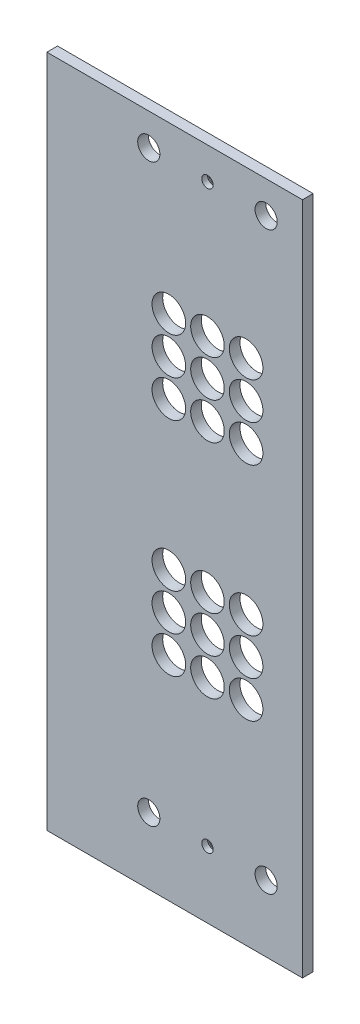
ISO-10303-21;
HEADER;
FILE_DESCRIPTION(('STEP AP214'),'2;1');
FILE_NAME('part.step','',(''),(''),'','','');
FILE_SCHEMA(('AUTOMOTIVE_DESIGN { 1 0 10303 214 1 1 1 1 }'));
ENDSEC;
DATA;
#1=APPLICATION_CONTEXT('core data for automotive mechanical design processes');
#2=APPLICATION_PROTOCOL_DEFINITION('international standard','automotive_design',2000,#1);
#3=PRODUCT_CONTEXT('',#1,'mechanical');
#4=PRODUCT('Part','Part','',(#3));
#5=PRODUCT_RELATED_PRODUCT_CATEGORY('part','',(#4));
#6=PRODUCT_DEFINITION_FORMATION('','',#4);
#7=PRODUCT_DEFINITION_CONTEXT('part definition',#1,'design');
#8=PRODUCT_DEFINITION('design','',#6,#7);
#9=PRODUCT_DEFINITION_SHAPE('','',#8);
#10=(LENGTH_UNIT() NAMED_UNIT(*) SI_UNIT(.MILLI.,.METRE.));
#11=(NAMED_UNIT(*) PLANE_ANGLE_UNIT() SI_UNIT($,.RADIAN.));
#12=(NAMED_UNIT(*) SI_UNIT($,.STERADIAN.) SOLID_ANGLE_UNIT());
#13=UNCERTAINTY_MEASURE_WITH_UNIT(LENGTH_MEASURE(1.E-05),#10,'distance_accuracy_value','');
#14=(GEOMETRIC_REPRESENTATION_CONTEXT(3) GLOBAL_UNCERTAINTY_ASSIGNED_CONTEXT((#13)) GLOBAL_UNIT_ASSIGNED_CONTEXT((#10,
#11,#12)) REPRESENTATION_CONTEXT('',''));
#15=CARTESIAN_POINT('',(0.,0.,0.));
#16=DIRECTION('',(0.,0.,1.));
#17=DIRECTION('',(1.,0.,0.));
#18=AXIS2_PLACEMENT_3D('',#15,#16,#17);
#19=CARTESIAN_POINT('',(28.275,98.7125,3.175));
#20=DIRECTION('',(-1.,0.,0.));
#21=DIRECTION('',(0.,-1.,0.));
#22=AXIS2_PLACEMENT_3D('',#19,#20,#21);
#23=PLANE('',#22);
#24=DIRECTION('',(0.,1.,0.));
#25=VECTOR('',#24,1.);
#26=CARTESIAN_POINT('',(28.275,98.7125,0.));
#27=LINE('',#26,#25);
#28=CARTESIAN_POINT('',(28.275,-98.7125,0.));
#29=VERTEX_POINT('',#28);
#30=CARTESIAN_POINT('',(28.275,101.8875,0.));
#31=VERTEX_POINT('',#30);
#32=EDGE_CURVE('E76',#29,#31,#27,.T.);
#33=ORIENTED_EDGE('',*,*,#32,.T.);
#34=DIRECTION('',(0.,0.,-1.));
#35=VECTOR('',#34,1.);
#36=CARTESIAN_POINT('',(28.275,101.8875,3.175));
#37=LINE('',#36,#35);
#38=CARTESIAN_POINT('',(28.275,101.8875,3.175));
#39=VERTEX_POINT('',#38);
#40=EDGE_CURVE('E80',#39,#31,#37,.T.);
#41=ORIENTED_EDGE('',*,*,#40,.F.);
#42=DIRECTION('',(0.,1.,0.));
#43=VECTOR('',#42,1.);
#44=CARTESIAN_POINT('',(28.275,98.7125,3.175));
#45=LINE('',#44,#43);
#46=CARTESIAN_POINT('',(28.275,-98.7125,3.175));
#47=VERTEX_POINT('',#46);
#48=EDGE_CURVE('E221',#47,#39,#45,.T.);
#49=ORIENTED_EDGE('',*,*,#48,.F.);
#50=DIRECTION('',(0.,0.,-1.));
#51=VECTOR('',#50,1.);
#52=CARTESIAN_POINT('',(28.275,-98.7125,3.175));
#53=LINE('',#52,#51);
#54=EDGE_CURVE('E11',#47,#29,#53,.T.);
#55=ORIENTED_EDGE('',*,*,#54,.T.);
#56=EDGE_LOOP('',(#33,#41,#49,#55));
#57=FACE_BOUND('',#56,.T.);
#58=ADVANCED_FACE('F41',(#57),#23,.F.);
#59=CARTESIAN_POINT('',(-28.275,-98.7125,3.175));
#60=DIRECTION('',(0.,1.,0.));
#61=DIRECTION('',(0.,0.,1.));
#62=AXIS2_PLACEMENT_3D('',#59,#60,#61);
#63=PLANE('',#62);
#64=DIRECTION('',(1.,0.,0.));
#65=VECTOR('',#64,1.);
#66=CARTESIAN_POINT('',(-28.275,-98.7125,0.));
#67=LINE('',#66,#65);
#68=CARTESIAN_POINT('',(-47.8,-98.7125,0.));
#69=VERTEX_POINT('',#68);
#70=EDGE_CURVE('E82',#69,#29,#67,.T.);
#71=ORIENTED_EDGE('',*,*,#70,.T.);
#72=ORIENTED_EDGE('',*,*,#54,.F.);
#73=DIRECTION('',(1.,0.,0.));
#74=VECTOR('',#73,1.);
#75=CARTESIAN_POINT('',(-28.275,-98.7125,3.175));
#76=LINE('',#75,#74);
#77=CARTESIAN_POINT('',(-47.8,-98.7125,3.175));
#78=VERTEX_POINT('',#77);
#79=EDGE_CURVE('E49',#78,#47,#76,.T.);
#80=ORIENTED_EDGE('',*,*,#79,.F.);
#81=DIRECTION('',(0.,0.,1.));
#82=VECTOR('',#81,1.);
#83=CARTESIAN_POINT('',(-47.8,-98.7125,0.));
#84=LINE('',#83,#82);
#85=EDGE_CURVE('E109',#69,#78,#84,.T.);
#86=ORIENTED_EDGE('',*,*,#85,.F.);
#87=EDGE_LOOP('',(#71,#72,#80,#86));
#88=FACE_BOUND('',#87,.T.);
#89=ADVANCED_FACE('F225',(#88),#63,.F.);
#90=CARTESIAN_POINT('',(0.,0.,3.175));
#91=DIRECTION('',(0.,0.,1.));
#92=DIRECTION('',(1.,0.,0.));
#93=AXIS2_PLACEMENT_3D('',#90,#91,#92);
#94=PLANE('',#93);
#95=CARTESIAN_POINT('',(2.7748636721725E-11,-78.8874998999741,3.175));
#96=DIRECTION('',(0.,0.,-1.));
#97=DIRECTION('',(-1.,0.,0.));
#98=AXIS2_PLACEMENT_3D('',#95,#96,#97);
#99=CIRCLE('',#98,1.69999999999999);
#100=CARTESIAN_POINT('',(-1.69999999997224,-78.8874998999741,3.175));
#101=VERTEX_POINT('',#100);
#102=EDGE_CURVE('E658',#101,#101,#99,.T.);
#103=ORIENTED_EDGE('',*,*,#102,.T.);
#104=EDGE_LOOP('',(#103));
#105=FACE_BOUND('',#104,.T.);
#106=CARTESIAN_POINT('',(3.18841642153557E-11,92.3625001000331,3.175));
#107=DIRECTION('',(0.,0.,-1.));
#108=DIRECTION('',(-1.,0.,0.));
#109=AXIS2_PLACEMENT_3D('',#106,#107,#108);
#110=CIRCLE('',#109,1.69999999999999);
#111=CARTESIAN_POINT('',(-1.6999999999681,92.3625001000331,3.175));
#112=VERTEX_POINT('',#111);
#113=EDGE_CURVE('E668',#112,#112,#110,.T.);
#114=ORIENTED_EDGE('',*,*,#113,.T.);
#115=EDGE_LOOP('',(#114));
#116=FACE_BOUND('',#115,.T.);
#117=CARTESIAN_POINT('',(-17.462499999999,92.362500099974,3.175));
#118=DIRECTION('',(0.,0.,1.));
#119=DIRECTION('',(1.,0.,0.));
#120=AXIS2_PLACEMENT_3D('',#117,#118,#119);
#121=CIRCLE('',#120,3.29999999999999);
#122=CARTESIAN_POINT('',(-14.1624999999991,92.362500099974,3.175));
#123=VERTEX_POINT('',#122);
#124=EDGE_CURVE('E671',#123,#123,#121,.T.);
#125=ORIENTED_EDGE('',*,*,#124,.F.);
#126=EDGE_LOOP('',(#125));
#127=FACE_BOUND('',#126,.T.);
#128=CARTESIAN_POINT('',(17.462500000001,92.362500099974,3.175));
#129=DIRECTION('',(0.,0.,1.));
#130=DIRECTION('',(1.,0.,0.));
#131=AXIS2_PLACEMENT_3D('',#128,#129,#130);
#132=CIRCLE('',#131,3.29999999999999);
#133=CARTESIAN_POINT('',(20.7625000000009,92.362500099974,3.175));
#134=VERTEX_POINT('',#133);
#135=EDGE_CURVE('E677',#134,#134,#132,.T.);
#136=ORIENTED_EDGE('',*,*,#135,.F.);
#137=EDGE_LOOP('',(#136));
#138=FACE_BOUND('',#137,.T.);
#139=CARTESIAN_POINT('',(17.4625000000277,-78.8874998999741,3.175));
#140=DIRECTION('',(0.,0.,1.));
#141=DIRECTION('',(1.,0.,0.));
#142=AXIS2_PLACEMENT_3D('',#139,#140,#141);
#143=CIRCLE('',#142,3.29999999999999);
#144=CARTESIAN_POINT('',(20.7625000000277,-78.8874998999741,3.175));
#145=VERTEX_POINT('',#144);
#146=EDGE_CURVE('E683',#145,#145,#143,.T.);
#147=ORIENTED_EDGE('',*,*,#146,.F.);
#148=EDGE_LOOP('',(#147));
#149=FACE_BOUND('',#148,.T.);
#150=CARTESIAN_POINT('',(-17.4624999999723,-78.8874998999741,3.175));
#151=DIRECTION('',(0.,0.,1.));
#152=DIRECTION('',(1.,0.,0.));
#153=AXIS2_PLACEMENT_3D('',#150,#151,#152);
#154=CIRCLE('',#153,3.29999999999999);
#155=CARTESIAN_POINT('',(-14.1624999999723,-78.8874998999741,3.175));
#156=VERTEX_POINT('',#155);
#157=EDGE_CURVE('E102',#156,#156,#154,.T.);
#158=ORIENTED_EDGE('',*,*,#157,.F.);
#159=EDGE_LOOP('',(#158));
#160=FACE_BOUND('',#159,.T.);
#161=CARTESIAN_POINT('',(0.,30.6308371608476,3.175));
#162=DIRECTION('',(0.,0.,-1.));
#163=DIRECTION('',(-1.,0.,0.));
#164=AXIS2_PLACEMENT_3D('',#161,#162,#163);
#165=CIRCLE('',#164,4.9999999999989);
#166=CARTESIAN_POINT('',(-4.99999999999893,30.6308371608476,3.175));
#167=VERTEX_POINT('',#166);
#168=EDGE_CURVE('E149',#167,#167,#165,.T.);
#169=ORIENTED_EDGE('',*,*,#168,.T.);
#170=EDGE_LOOP('',(#169));
#171=FACE_BOUND('',#170,.T.);
#172=CARTESIAN_POINT('',(11.5,30.6308371608476,3.175));
#173=DIRECTION('',(0.,0.,-1.));
#174=DIRECTION('',(-1.,0.,0.));
#175=AXIS2_PLACEMENT_3D('',#172,#173,#174);
#176=CIRCLE('',#175,4.9999999999989);
#177=CARTESIAN_POINT('',(6.50000000000107,30.6308371608476,3.175));
#178=VERTEX_POINT('',#177);
#179=EDGE_CURVE('E155',#178,#178,#176,.T.);
#180=ORIENTED_EDGE('',*,*,#179,.T.);
#181=EDGE_LOOP('',(#180));
#182=FACE_BOUND('',#181,.T.);
#183=CARTESIAN_POINT('',(-11.5,41.6308371608475,3.175));
#184=DIRECTION('',(0.,0.,-1.));
#185=DIRECTION('',(-1.,0.,0.));
#186=AXIS2_PLACEMENT_3D('',#183,#184,#185);
#187=CIRCLE('',#186,4.9999999999989);
#188=CARTESIAN_POINT('',(-16.4999999999989,41.6308371608475,3.175));
#189=VERTEX_POINT('',#188);
#190=EDGE_CURVE('E161',#189,#189,#187,.T.);
#191=ORIENTED_EDGE('',*,*,#190,.T.);
#192=EDGE_LOOP('',(#191));
#193=FACE_BOUND('',#192,.T.);
#194=CARTESIAN_POINT('',(0.,41.6308371608475,3.175));
#195=DIRECTION('',(0.,0.,-1.));
#196=DIRECTION('',(-1.,0.,0.));
#197=AXIS2_PLACEMENT_3D('',#194,#195,#196);
#198=CIRCLE('',#197,4.9999999999989);
#199=CARTESIAN_POINT('',(-4.99999999999893,41.6308371608475,3.175));
#200=VERTEX_POINT('',#199);
#201=EDGE_CURVE('E136',#200,#200,#198,.T.);
#202=ORIENTED_EDGE('',*,*,#201,.T.);
#203=EDGE_LOOP('',(#202));
#204=FACE_BOUND('',#203,.T.);
#205=CARTESIAN_POINT('',(11.5,52.6308371608475,3.175));
#206=DIRECTION('',(0.,0.,-1.));
#207=DIRECTION('',(-1.,0.,0.));
#208=AXIS2_PLACEMENT_3D('',#205,#206,#207);
#209=CIRCLE('',#208,4.9999999999989);
#210=CARTESIAN_POINT('',(6.50000000000107,52.6308371608475,3.175));
#211=VERTEX_POINT('',#210);
#212=EDGE_CURVE('E118',#211,#211,#209,.T.);
#213=ORIENTED_EDGE('',*,*,#212,.T.);
#214=EDGE_LOOP('',(#213));
#215=FACE_BOUND('',#214,.T.);
#216=CARTESIAN_POINT('',(0.,52.6308371608475,3.175));
#217=DIRECTION('',(0.,0.,-1.));
#218=DIRECTION('',(-1.,0.,0.));
#219=AXIS2_PLACEMENT_3D('',#216,#217,#218);
#220=CIRCLE('',#219,4.9999999999989);
#221=CARTESIAN_POINT('',(-4.99999999999893,52.6308371608475,3.175));
#222=VERTEX_POINT('',#221);
#223=EDGE_CURVE('E125',#222,#222,#220,.T.);
#224=ORIENTED_EDGE('',*,*,#223,.T.);
#225=EDGE_LOOP('',(#224));
#226=FACE_BOUND('',#225,.T.);
#227=CARTESIAN_POINT('',(-11.5,52.6308371608475,3.175));
#228=DIRECTION('',(0.,0.,-1.));
#229=DIRECTION('',(-1.,0.,0.));
#230=AXIS2_PLACEMENT_3D('',#227,#228,#229);
#231=CIRCLE('',#230,4.9999999999989);
#232=CARTESIAN_POINT('',(-16.4999999999989,52.6308371608475,3.175));
#233=VERTEX_POINT('',#232);
#234=EDGE_CURVE('E124',#233,#233,#231,.T.);
#235=ORIENTED_EDGE('',*,*,#234,.T.);
#236=EDGE_LOOP('',(#235));
#237=FACE_BOUND('',#236,.T.);
#238=CARTESIAN_POINT('',(11.5,41.6308371608475,3.175));
#239=DIRECTION('',(0.,0.,-1.));
#240=DIRECTION('',(-1.,0.,0.));
#241=AXIS2_PLACEMENT_3D('',#238,#239,#240);
#242=CIRCLE('',#241,4.9999999999989);
#243=CARTESIAN_POINT('',(6.50000000000107,41.6308371608475,3.175));
#244=VERTEX_POINT('',#243);
#245=EDGE_CURVE('E137',#244,#244,#242,.T.);
#246=ORIENTED_EDGE('',*,*,#245,.T.);
#247=EDGE_LOOP('',(#246));
#248=FACE_BOUND('',#247,.T.);
#249=CARTESIAN_POINT('',(-11.5,-13.3691628391524,3.175));
#250=DIRECTION('',(0.,0.,-1.));
#251=DIRECTION('',(-1.,0.,0.));
#252=AXIS2_PLACEMENT_3D('',#249,#250,#251);
#253=CIRCLE('',#252,4.9999999999989);
#254=CARTESIAN_POINT('',(-16.4999999999989,-13.3691628391524,3.175));
#255=VERTEX_POINT('',#254);
#256=EDGE_CURVE('E209',#255,#255,#253,.T.);
#257=ORIENTED_EDGE('',*,*,#256,.T.);
#258=EDGE_LOOP('',(#257));
#259=FACE_BOUND('',#258,.T.);
#260=CARTESIAN_POINT('',(0.,-13.3691628391524,3.175));
#261=DIRECTION('',(0.,0.,-1.));
#262=DIRECTION('',(-1.,0.,0.));
#263=AXIS2_PLACEMENT_3D('',#260,#261,#262);
#264=CIRCLE('',#263,4.9999999999989);
#265=CARTESIAN_POINT('',(-4.99999999999892,-13.3691628391524,3.175));
#266=VERTEX_POINT('',#265);
#267=EDGE_CURVE('E198',#266,#266,#264,.T.);
#268=ORIENTED_EDGE('',*,*,#267,.T.);
#269=EDGE_LOOP('',(#268));
#270=FACE_BOUND('',#269,.T.);
#271=CARTESIAN_POINT('',(11.5,-13.3691628391524,3.175));
#272=DIRECTION('',(0.,0.,-1.));
#273=DIRECTION('',(-1.,0.,0.));
#274=AXIS2_PLACEMENT_3D('',#271,#272,#273);
#275=CIRCLE('',#274,4.9999999999989);
#276=CARTESIAN_POINT('',(6.50000000000108,-13.3691628391524,3.175));
#277=VERTEX_POINT('',#276);
#278=EDGE_CURVE('E199',#277,#277,#275,.T.);
#279=ORIENTED_EDGE('',*,*,#278,.T.);
#280=EDGE_LOOP('',(#279));
#281=FACE_BOUND('',#280,.T.);
#282=CARTESIAN_POINT('',(-11.5,30.6308371608476,3.175));
#283=DIRECTION('',(0.,0.,-1.));
#284=DIRECTION('',(-1.,0.,0.));
#285=AXIS2_PLACEMENT_3D('',#282,#283,#284);
#286=CIRCLE('',#285,4.9999999999989);
#287=CARTESIAN_POINT('',(-16.4999999999989,30.6308371608476,3.175));
#288=VERTEX_POINT('',#287);
#289=EDGE_CURVE('E148',#288,#288,#286,.T.);
#290=ORIENTED_EDGE('',*,*,#289,.T.);
#291=EDGE_LOOP('',(#290));
#292=FACE_BOUND('',#291,.T.);
#293=CARTESIAN_POINT('',(0.,-35.3691628391525,3.175));
#294=DIRECTION('',(0.,0.,-1.));
#295=DIRECTION('',(-1.,0.,0.));
#296=AXIS2_PLACEMENT_3D('',#293,#294,#295);
#297=CIRCLE('',#296,4.9999999999989);
#298=CARTESIAN_POINT('',(-4.99999999999892,-35.3691628391525,3.175));
#299=VERTEX_POINT('',#298);
#300=EDGE_CURVE('E187',#299,#299,#297,.T.);
#301=ORIENTED_EDGE('',*,*,#300,.T.);
#302=EDGE_LOOP('',(#301));
#303=FACE_BOUND('',#302,.T.);
#304=CARTESIAN_POINT('',(-11.5,-24.3691628391524,3.175));
#305=DIRECTION('',(0.,0.,-1.));
#306=DIRECTION('',(-1.,0.,0.));
#307=AXIS2_PLACEMENT_3D('',#304,#305,#306);
#308=CIRCLE('',#307,4.9999999999989);
#309=CARTESIAN_POINT('',(-16.4999999999989,-24.3691628391524,3.175));
#310=VERTEX_POINT('',#309);
#311=EDGE_CURVE('E172',#310,#310,#308,.T.);
#312=ORIENTED_EDGE('',*,*,#311,.T.);
#313=EDGE_LOOP('',(#312));
#314=FACE_BOUND('',#313,.T.);
#315=CARTESIAN_POINT('',(0.,-24.3691628391524,3.175));
#316=DIRECTION('',(0.,0.,-1.));
#317=DIRECTION('',(-1.,0.,0.));
#318=AXIS2_PLACEMENT_3D('',#315,#316,#317);
#319=CIRCLE('',#318,4.9999999999989);
#320=CARTESIAN_POINT('',(-4.99999999999892,-24.3691628391524,3.175));
#321=VERTEX_POINT('',#320);
#322=EDGE_CURVE('E173',#321,#321,#319,.T.);
#323=ORIENTED_EDGE('',*,*,#322,.T.);
#324=EDGE_LOOP('',(#323));
#325=FACE_BOUND('',#324,.T.);
#326=CARTESIAN_POINT('',(11.5,-24.3691628391524,3.175));
#327=DIRECTION('',(0.,0.,-1.));
#328=DIRECTION('',(-1.,0.,0.));
#329=AXIS2_PLACEMENT_3D('',#326,#327,#328);
#330=CIRCLE('',#329,4.9999999999989);
#331=CARTESIAN_POINT('',(6.50000000000108,-24.3691628391524,3.175));
#332=VERTEX_POINT('',#331);
#333=EDGE_CURVE('E179',#332,#332,#330,.T.);
#334=ORIENTED_EDGE('',*,*,#333,.T.);
#335=EDGE_LOOP('',(#334));
#336=FACE_BOUND('',#335,.T.);
#337=CARTESIAN_POINT('',(11.5,-35.3691628391525,3.175));
#338=DIRECTION('',(0.,0.,-1.));
#339=DIRECTION('',(-1.,0.,0.));
#340=AXIS2_PLACEMENT_3D('',#337,#338,#339);
#341=CIRCLE('',#340,4.9999999999989);
#342=CARTESIAN_POINT('',(6.50000000000108,-35.3691628391525,3.175));
#343=VERTEX_POINT('',#342);
#344=EDGE_CURVE('E114',#343,#343,#341,.T.);
#345=ORIENTED_EDGE('',*,*,#344,.T.);
#346=EDGE_LOOP('',(#345));
#347=FACE_BOUND('',#346,.T.);
#348=CARTESIAN_POINT('',(-11.5,-35.3691628391525,3.175));
#349=DIRECTION('',(0.,0.,-1.));
#350=DIRECTION('',(-1.,0.,0.));
#351=AXIS2_PLACEMENT_3D('',#348,#349,#350);
#352=CIRCLE('',#351,4.9999999999989);
#353=CARTESIAN_POINT('',(-16.4999999999989,-35.3691628391525,3.175));
#354=VERTEX_POINT('',#353);
#355=EDGE_CURVE('E83',#354,#354,#352,.T.);
#356=ORIENTED_EDGE('',*,*,#355,.T.);
#357=EDGE_LOOP('',(#356));
#358=FACE_BOUND('',#357,.T.);
#359=ORIENTED_EDGE('',*,*,#48,.T.);
#360=DIRECTION('',(1.,0.,0.));
#361=VECTOR('',#360,1.);
#362=CARTESIAN_POINT('',(-47.8,101.8875,3.175));
#363=LINE('',#362,#361);
#364=CARTESIAN_POINT('',(-47.8,101.8875,3.175));
#365=VERTEX_POINT('',#364);
#366=EDGE_CURVE('E98',#365,#39,#363,.T.);
#367=ORIENTED_EDGE('',*,*,#366,.F.);
#368=DIRECTION('',(0.,1.,0.));
#369=VECTOR('',#368,1.);
#370=CARTESIAN_POINT('',(-47.8,-98.7125,3.175));
#371=LINE('',#370,#369);
#372=EDGE_CURVE('E112',#78,#365,#371,.T.);
#373=ORIENTED_EDGE('',*,*,#372,.F.);
#374=ORIENTED_EDGE('',*,*,#79,.T.);
#375=EDGE_LOOP('',(#359,#367,#373,#374));
#376=FACE_BOUND('',#375,.T.);
#377=ADVANCED_FACE('F228',(#105,#116,#127,#138,#149,#160,#171,#182,#193,#204,#215,#226,#237,
#248,#259,#270,#281,#292,#303,#314,#325,#336,#347,#358,#376),#94,.T.);
#378=CARTESIAN_POINT('',(0.,0.,0.));
#379=DIRECTION('',(0.,0.,1.));
#380=DIRECTION('',(1.,0.,0.));
#381=AXIS2_PLACEMENT_3D('',#378,#379,#380);
#382=PLANE('',#381);
#383=CARTESIAN_POINT('',(2.7748636721725E-11,-78.8874998999741,0.));
#384=DIRECTION('',(0.,0.,-1.));
#385=DIRECTION('',(-1.,0.,0.));
#386=AXIS2_PLACEMENT_3D('',#383,#384,#385);
#387=CIRCLE('',#386,3.15);
#388=CARTESIAN_POINT('',(-3.14999999997225,-78.8874998999741,0.));
#389=VERTEX_POINT('',#388);
#390=EDGE_CURVE('E656',#389,#389,#387,.T.);
#391=ORIENTED_EDGE('',*,*,#390,.F.);
#392=EDGE_LOOP('',(#391));
#393=FACE_BOUND('',#392,.T.);
#394=CARTESIAN_POINT('',(3.18841642153557E-11,92.3625001000331,0.));
#395=DIRECTION('',(0.,0.,-1.));
#396=DIRECTION('',(-1.,0.,0.));
#397=AXIS2_PLACEMENT_3D('',#394,#395,#396);
#398=CIRCLE('',#397,3.15);
#399=CARTESIAN_POINT('',(-3.14999999996812,92.3625001000331,0.));
#400=VERTEX_POINT('',#399);
#401=EDGE_CURVE('E662',#400,#400,#398,.T.);
#402=ORIENTED_EDGE('',*,*,#401,.F.);
#403=EDGE_LOOP('',(#402));
#404=FACE_BOUND('',#403,.T.);
#405=CARTESIAN_POINT('',(-17.462499999999,92.362500099974,0.));
#406=DIRECTION('',(0.,0.,1.));
#407=DIRECTION('',(1.,0.,0.));
#408=AXIS2_PLACEMENT_3D('',#405,#406,#407);
#409=CIRCLE('',#408,3.29999999999999);
#410=CARTESIAN_POINT('',(-14.1624999999991,92.362500099974,0.));
#411=VERTEX_POINT('',#410);
#412=EDGE_CURVE('E674',#411,#411,#409,.T.);
#413=ORIENTED_EDGE('',*,*,#412,.T.);
#414=EDGE_LOOP('',(#413));
#415=FACE_BOUND('',#414,.T.);
#416=CARTESIAN_POINT('',(17.462500000001,92.362500099974,0.));
#417=DIRECTION('',(0.,0.,1.));
#418=DIRECTION('',(1.,0.,0.));
#419=AXIS2_PLACEMENT_3D('',#416,#417,#418);
#420=CIRCLE('',#419,3.29999999999999);
#421=CARTESIAN_POINT('',(20.7625000000009,92.362500099974,0.));
#422=VERTEX_POINT('',#421);
#423=EDGE_CURVE('E680',#422,#422,#420,.T.);
#424=ORIENTED_EDGE('',*,*,#423,.T.);
#425=EDGE_LOOP('',(#424));
#426=FACE_BOUND('',#425,.T.);
#427=CARTESIAN_POINT('',(17.4625000000277,-78.8874998999741,0.));
#428=DIRECTION('',(0.,0.,1.));
#429=DIRECTION('',(1.,0.,0.));
#430=AXIS2_PLACEMENT_3D('',#427,#428,#429);
#431=CIRCLE('',#430,3.29999999999999);
#432=CARTESIAN_POINT('',(20.7625000000277,-78.8874998999741,0.));
#433=VERTEX_POINT('',#432);
#434=EDGE_CURVE('E686',#433,#433,#431,.T.);
#435=ORIENTED_EDGE('',*,*,#434,.T.);
#436=EDGE_LOOP('',(#435));
#437=FACE_BOUND('',#436,.T.);
#438=CARTESIAN_POINT('',(-17.4624999999723,-78.8874998999741,0.));
#439=DIRECTION('',(0.,0.,1.));
#440=DIRECTION('',(1.,0.,0.));
#441=AXIS2_PLACEMENT_3D('',#438,#439,#440);
#442=CIRCLE('',#441,3.29999999999999);
#443=CARTESIAN_POINT('',(-14.1624999999723,-78.8874998999741,0.));
#444=VERTEX_POINT('',#443);
#445=EDGE_CURVE('E99',#444,#444,#442,.T.);
#446=ORIENTED_EDGE('',*,*,#445,.T.);
#447=EDGE_LOOP('',(#446));
#448=FACE_BOUND('',#447,.T.);
#449=CARTESIAN_POINT('',(0.,30.6308371608476,0.));
#450=DIRECTION('',(0.,0.,-1.));
#451=DIRECTION('',(-1.,0.,0.));
#452=AXIS2_PLACEMENT_3D('',#449,#450,#451);
#453=CIRCLE('',#452,4.9999999999989);
#454=CARTESIAN_POINT('',(-4.99999999999893,30.6308371608476,0.));
#455=VERTEX_POINT('',#454);
#456=EDGE_CURVE('E145',#455,#455,#453,.T.);
#457=ORIENTED_EDGE('',*,*,#456,.F.);
#458=EDGE_LOOP('',(#457));
#459=FACE_BOUND('',#458,.T.);
#460=CARTESIAN_POINT('',(11.5,30.6308371608476,0.));
#461=DIRECTION('',(0.,0.,-1.));
#462=DIRECTION('',(-1.,0.,0.));
#463=AXIS2_PLACEMENT_3D('',#460,#461,#462);
#464=CIRCLE('',#463,4.9999999999989);
#465=CARTESIAN_POINT('',(6.50000000000107,30.6308371608476,0.));
#466=VERTEX_POINT('',#465);
#467=EDGE_CURVE('E152',#466,#466,#464,.T.);
#468=ORIENTED_EDGE('',*,*,#467,.F.);
#469=EDGE_LOOP('',(#468));
#470=FACE_BOUND('',#469,.T.);
#471=CARTESIAN_POINT('',(-11.5,41.6308371608475,0.));
#472=DIRECTION('',(0.,0.,-1.));
#473=DIRECTION('',(-1.,0.,0.));
#474=AXIS2_PLACEMENT_3D('',#471,#472,#473);
#475=CIRCLE('',#474,4.9999999999989);
#476=CARTESIAN_POINT('',(-16.4999999999989,41.6308371608475,0.));
#477=VERTEX_POINT('',#476);
#478=EDGE_CURVE('E158',#477,#477,#475,.T.);
#479=ORIENTED_EDGE('',*,*,#478,.F.);
#480=EDGE_LOOP('',(#479));
#481=FACE_BOUND('',#480,.T.);
#482=CARTESIAN_POINT('',(0.,41.6308371608475,0.));
#483=DIRECTION('',(0.,0.,-1.));
#484=DIRECTION('',(-1.,0.,0.));
#485=AXIS2_PLACEMENT_3D('',#482,#483,#484);
#486=CIRCLE('',#485,4.9999999999989);
#487=CARTESIAN_POINT('',(-4.99999999999893,41.6308371608475,0.));
#488=VERTEX_POINT('',#487);
#489=EDGE_CURVE('E164',#488,#488,#486,.T.);
#490=ORIENTED_EDGE('',*,*,#489,.F.);
#491=EDGE_LOOP('',(#490));
#492=FACE_BOUND('',#491,.T.);
#493=CARTESIAN_POINT('',(11.5,52.6308371608475,0.));
#494=DIRECTION('',(0.,0.,-1.));
#495=DIRECTION('',(-1.,0.,0.));
#496=AXIS2_PLACEMENT_3D('',#493,#494,#495);
#497=CIRCLE('',#496,4.9999999999989);
#498=CARTESIAN_POINT('',(6.50000000000107,52.6308371608475,0.));
#499=VERTEX_POINT('',#498);
#500=EDGE_CURVE('E128',#499,#499,#497,.T.);
#501=ORIENTED_EDGE('',*,*,#500,.F.);
#502=EDGE_LOOP('',(#501));
#503=FACE_BOUND('',#502,.T.);
#504=CARTESIAN_POINT('',(0.,52.6308371608475,0.));
#505=DIRECTION('',(0.,0.,-1.));
#506=DIRECTION('',(-1.,0.,0.));
#507=AXIS2_PLACEMENT_3D('',#504,#505,#506);
#508=CIRCLE('',#507,4.9999999999989);
#509=CARTESIAN_POINT('',(-4.99999999999893,52.6308371608475,0.));
#510=VERTEX_POINT('',#509);
#511=EDGE_CURVE('E121',#510,#510,#508,.T.);
#512=ORIENTED_EDGE('',*,*,#511,.F.);
#513=EDGE_LOOP('',(#512));
#514=FACE_BOUND('',#513,.T.);
#515=CARTESIAN_POINT('',(-11.5,52.6308371608475,0.));
#516=DIRECTION('',(0.,0.,-1.));
#517=DIRECTION('',(-1.,0.,0.));
#518=AXIS2_PLACEMENT_3D('',#515,#516,#517);
#519=CIRCLE('',#518,4.9999999999989);
#520=CARTESIAN_POINT('',(-16.4999999999989,52.6308371608475,0.));
#521=VERTEX_POINT('',#520);
#522=EDGE_CURVE('E140',#521,#521,#519,.T.);
#523=ORIENTED_EDGE('',*,*,#522,.F.);
#524=EDGE_LOOP('',(#523));
#525=FACE_BOUND('',#524,.T.);
#526=CARTESIAN_POINT('',(11.5,41.6308371608475,0.));
#527=DIRECTION('',(0.,0.,-1.));
#528=DIRECTION('',(-1.,0.,0.));
#529=AXIS2_PLACEMENT_3D('',#526,#527,#528);
#530=CIRCLE('',#529,4.9999999999989);
#531=CARTESIAN_POINT('',(6.50000000000107,41.6308371608475,0.));
#532=VERTEX_POINT('',#531);
#533=EDGE_CURVE('E133',#532,#532,#530,.T.);
#534=ORIENTED_EDGE('',*,*,#533,.F.);
#535=EDGE_LOOP('',(#534));
#536=FACE_BOUND('',#535,.T.);
#537=CARTESIAN_POINT('',(-11.5,-13.3691628391524,0.));
#538=DIRECTION('',(0.,0.,-1.));
#539=DIRECTION('',(-1.,0.,0.));
#540=AXIS2_PLACEMENT_3D('',#537,#538,#539);
#541=CIRCLE('',#540,4.9999999999989);
#542=CARTESIAN_POINT('',(-16.4999999999989,-13.3691628391524,0.));
#543=VERTEX_POINT('',#542);
#544=EDGE_CURVE('E182',#543,#543,#541,.T.);
#545=ORIENTED_EDGE('',*,*,#544,.F.);
#546=EDGE_LOOP('',(#545));
#547=FACE_BOUND('',#546,.T.);
#548=CARTESIAN_POINT('',(0.,-13.3691628391524,0.));
#549=DIRECTION('',(0.,0.,-1.));
#550=DIRECTION('',(-1.,0.,0.));
#551=AXIS2_PLACEMENT_3D('',#548,#549,#550);
#552=CIRCLE('',#551,4.9999999999989);
#553=CARTESIAN_POINT('',(-4.99999999999892,-13.3691628391524,0.));
#554=VERTEX_POINT('',#553);
#555=EDGE_CURVE('E212',#554,#554,#552,.T.);
#556=ORIENTED_EDGE('',*,*,#555,.F.);
#557=EDGE_LOOP('',(#556));
#558=FACE_BOUND('',#557,.T.);
#559=CARTESIAN_POINT('',(11.5,-13.3691628391524,0.));
#560=DIRECTION('',(0.,0.,-1.));
#561=DIRECTION('',(-1.,0.,0.));
#562=AXIS2_PLACEMENT_3D('',#559,#560,#561);
#563=CIRCLE('',#562,4.9999999999989);
#564=CARTESIAN_POINT('',(6.50000000000108,-13.3691628391524,0.));
#565=VERTEX_POINT('',#564);
#566=EDGE_CURVE('E195',#565,#565,#563,.T.);
#567=ORIENTED_EDGE('',*,*,#566,.F.);
#568=EDGE_LOOP('',(#567));
#569=FACE_BOUND('',#568,.T.);
#570=CARTESIAN_POINT('',(-11.5,30.6308371608476,0.));
#571=DIRECTION('',(0.,0.,-1.));
#572=DIRECTION('',(-1.,0.,0.));
#573=AXIS2_PLACEMENT_3D('',#570,#571,#572);
#574=CIRCLE('',#573,4.9999999999989);
#575=CARTESIAN_POINT('',(-16.4999999999989,30.6308371608476,0.));
#576=VERTEX_POINT('',#575);
#577=EDGE_CURVE('E202',#576,#576,#574,.T.);
#578=ORIENTED_EDGE('',*,*,#577,.F.);
#579=EDGE_LOOP('',(#578));
#580=FACE_BOUND('',#579,.T.);
#581=CARTESIAN_POINT('',(0.,-35.3691628391525,0.));
#582=DIRECTION('',(0.,0.,-1.));
#583=DIRECTION('',(-1.,0.,0.));
#584=AXIS2_PLACEMENT_3D('',#581,#582,#583);
#585=CIRCLE('',#584,4.9999999999989);
#586=CARTESIAN_POINT('',(-4.99999999999892,-35.3691628391525,0.));
#587=VERTEX_POINT('',#586);
#588=EDGE_CURVE('E183',#587,#587,#585,.T.);
#589=ORIENTED_EDGE('',*,*,#588,.F.);
#590=EDGE_LOOP('',(#589));
#591=FACE_BOUND('',#590,.T.);
#592=CARTESIAN_POINT('',(-11.5,-24.3691628391524,0.));
#593=DIRECTION('',(0.,0.,-1.));
#594=DIRECTION('',(-1.,0.,0.));
#595=AXIS2_PLACEMENT_3D('',#592,#593,#594);
#596=CIRCLE('',#595,4.9999999999989);
#597=CARTESIAN_POINT('',(-16.4999999999989,-24.3691628391524,0.));
#598=VERTEX_POINT('',#597);
#599=EDGE_CURVE('E190',#598,#598,#596,.T.);
#600=ORIENTED_EDGE('',*,*,#599,.F.);
#601=EDGE_LOOP('',(#600));
#602=FACE_BOUND('',#601,.T.);
#603=CARTESIAN_POINT('',(0.,-24.3691628391524,0.));
#604=DIRECTION('',(0.,0.,-1.));
#605=DIRECTION('',(-1.,0.,0.));
#606=AXIS2_PLACEMENT_3D('',#603,#604,#605);
#607=CIRCLE('',#606,4.9999999999989);
#608=CARTESIAN_POINT('',(-4.99999999999892,-24.3691628391524,0.));
#609=VERTEX_POINT('',#608);
#610=EDGE_CURVE('E169',#609,#609,#607,.T.);
#611=ORIENTED_EDGE('',*,*,#610,.F.);
#612=EDGE_LOOP('',(#611));
#613=FACE_BOUND('',#612,.T.);
#614=CARTESIAN_POINT('',(11.5,-24.3691628391524,0.));
#615=DIRECTION('',(0.,0.,-1.));
#616=DIRECTION('',(-1.,0.,0.));
#617=AXIS2_PLACEMENT_3D('',#614,#615,#616);
#618=CIRCLE('',#617,4.9999999999989);
#619=CARTESIAN_POINT('',(6.50000000000108,-24.3691628391524,0.));
#620=VERTEX_POINT('',#619);
#621=EDGE_CURVE('E176',#620,#620,#618,.T.);
#622=ORIENTED_EDGE('',*,*,#621,.F.);
#623=EDGE_LOOP('',(#622));
#624=FACE_BOUND('',#623,.T.);
#625=CARTESIAN_POINT('',(11.5,-35.3691628391525,0.));
#626=DIRECTION('',(0.,0.,-1.));
#627=DIRECTION('',(-1.,0.,0.));
#628=AXIS2_PLACEMENT_3D('',#625,#626,#627);
#629=CIRCLE('',#628,4.9999999999989);
#630=CARTESIAN_POINT('',(6.50000000000108,-35.3691628391525,0.));
#631=VERTEX_POINT('',#630);
#632=EDGE_CURVE('E115',#631,#631,#629,.T.);
#633=ORIENTED_EDGE('',*,*,#632,.F.);
#634=EDGE_LOOP('',(#633));
#635=FACE_BOUND('',#634,.T.);
#636=CARTESIAN_POINT('',(-11.5,-35.3691628391525,0.));
#637=DIRECTION('',(0.,0.,-1.));
#638=DIRECTION('',(-1.,0.,0.));
#639=AXIS2_PLACEMENT_3D('',#636,#637,#638);
#640=CIRCLE('',#639,4.9999999999989);
#641=CARTESIAN_POINT('',(-16.4999999999989,-35.3691628391525,0.));
#642=VERTEX_POINT('',#641);
#643=EDGE_CURVE('E186',#642,#642,#640,.T.);
#644=ORIENTED_EDGE('',*,*,#643,.F.);
#645=EDGE_LOOP('',(#644));
#646=FACE_BOUND('',#645,.T.);
#647=ORIENTED_EDGE('',*,*,#32,.F.);
#648=ORIENTED_EDGE('',*,*,#70,.F.);
#649=DIRECTION('',(0.,-1.,0.));
#650=VECTOR('',#649,1.);
#651=CARTESIAN_POINT('',(-47.8,98.7125,0.));
#652=LINE('',#651,#650);
#653=CARTESIAN_POINT('',(-47.8,101.8875,0.));
#654=VERTEX_POINT('',#653);
#655=EDGE_CURVE('E89',#654,#69,#652,.T.);
#656=ORIENTED_EDGE('',*,*,#655,.F.);
#657=DIRECTION('',(-1.,0.,0.));
#658=VECTOR('',#657,1.);
#659=CARTESIAN_POINT('',(28.275,101.8875,0.));
#660=LINE('',#659,#658);
#661=EDGE_CURVE('E86',#31,#654,#660,.T.);
#662=ORIENTED_EDGE('',*,*,#661,.F.);
#663=EDGE_LOOP('',(#647,#648,#656,#662));
#664=FACE_BOUND('',#663,.T.);
#665=ADVANCED_FACE('F87',(#393,#404,#415,#426,#437,#448,#459,#470,#481,#492,#503,#514,#525,#536,
#547,#558,#569,#580,#591,#602,#613,#624,#635,#646,#664),#382,.F.);
#666=CARTESIAN_POINT('',(-11.5,-35.3691628391525,3.175));
#667=DIRECTION('',(0.,0.,-1.));
#668=DIRECTION('',(-1.,0.,0.));
#669=AXIS2_PLACEMENT_3D('',#666,#667,#668);
#670=CYLINDRICAL_SURFACE('',#669,4.9999999999989);
#671=ORIENTED_EDGE('',*,*,#355,.F.);
#672=EDGE_LOOP('',(#671));
#673=FACE_BOUND('',#672,.T.);
#674=ORIENTED_EDGE('',*,*,#643,.T.);
#675=EDGE_LOOP('',(#674));
#676=FACE_BOUND('',#675,.T.);
#677=ADVANCED_FACE('F236',(#673,#676),#670,.F.);
#678=CARTESIAN_POINT('',(11.5,-35.3691628391525,3.175));
#679=DIRECTION('',(0.,0.,-1.));
#680=DIRECTION('',(-1.,0.,0.));
#681=AXIS2_PLACEMENT_3D('',#678,#679,#680);
#682=CYLINDRICAL_SURFACE('',#681,4.9999999999989);
#683=ORIENTED_EDGE('',*,*,#344,.F.);
#684=EDGE_LOOP('',(#683));
#685=FACE_BOUND('',#684,.T.);
#686=ORIENTED_EDGE('',*,*,#632,.T.);
#687=EDGE_LOOP('',(#686));
#688=FACE_BOUND('',#687,.T.);
#689=ADVANCED_FACE('F347',(#685,#688),#682,.F.);
#690=CARTESIAN_POINT('',(11.5,-24.3691628391524,3.175));
#691=DIRECTION('',(0.,0.,-1.));
#692=DIRECTION('',(-1.,0.,0.));
#693=AXIS2_PLACEMENT_3D('',#690,#691,#692);
#694=CYLINDRICAL_SURFACE('',#693,4.9999999999989);
#695=ORIENTED_EDGE('',*,*,#333,.F.);
#696=EDGE_LOOP('',(#695));
#697=FACE_BOUND('',#696,.T.);
#698=ORIENTED_EDGE('',*,*,#621,.T.);
#699=EDGE_LOOP('',(#698));
#700=FACE_BOUND('',#699,.T.);
#701=ADVANCED_FACE('F350',(#697,#700),#694,.F.);
#702=CARTESIAN_POINT('',(0.,-24.3691628391524,3.175));
#703=DIRECTION('',(0.,0.,-1.));
#704=DIRECTION('',(-1.,0.,0.));
#705=AXIS2_PLACEMENT_3D('',#702,#703,#704);
#706=CYLINDRICAL_SURFACE('',#705,4.9999999999989);
#707=ORIENTED_EDGE('',*,*,#322,.F.);
#708=EDGE_LOOP('',(#707));
#709=FACE_BOUND('',#708,.T.);
#710=ORIENTED_EDGE('',*,*,#610,.T.);
#711=EDGE_LOOP('',(#710));
#712=FACE_BOUND('',#711,.T.);
#713=ADVANCED_FACE('F383',(#709,#712),#706,.F.);
#714=CARTESIAN_POINT('',(-11.5,-24.3691628391524,3.175));
#715=DIRECTION('',(0.,0.,-1.));
#716=DIRECTION('',(-1.,0.,0.));
#717=AXIS2_PLACEMENT_3D('',#714,#715,#716);
#718=CYLINDRICAL_SURFACE('',#717,4.9999999999989);
#719=ORIENTED_EDGE('',*,*,#311,.F.);
#720=EDGE_LOOP('',(#719));
#721=FACE_BOUND('',#720,.T.);
#722=ORIENTED_EDGE('',*,*,#599,.T.);
#723=EDGE_LOOP('',(#722));
#724=FACE_BOUND('',#723,.T.);
#725=ADVANCED_FACE('F386',(#721,#724),#718,.F.);
#726=CARTESIAN_POINT('',(0.,-35.3691628391525,3.175));
#727=DIRECTION('',(0.,0.,-1.));
#728=DIRECTION('',(-1.,0.,0.));
#729=AXIS2_PLACEMENT_3D('',#726,#727,#728);
#730=CYLINDRICAL_SURFACE('',#729,4.9999999999989);
#731=ORIENTED_EDGE('',*,*,#300,.F.);
#732=EDGE_LOOP('',(#731));
#733=FACE_BOUND('',#732,.T.);
#734=ORIENTED_EDGE('',*,*,#588,.T.);
#735=EDGE_LOOP('',(#734));
#736=FACE_BOUND('',#735,.T.);
#737=ADVANCED_FACE('F391',(#733,#736),#730,.F.);
#738=CARTESIAN_POINT('',(-11.5,30.6308371608476,3.175));
#739=DIRECTION('',(0.,0.,-1.));
#740=DIRECTION('',(-1.,0.,0.));
#741=AXIS2_PLACEMENT_3D('',#738,#739,#740);
#742=CYLINDRICAL_SURFACE('',#741,4.9999999999989);
#743=ORIENTED_EDGE('',*,*,#289,.F.);
#744=EDGE_LOOP('',(#743));
#745=FACE_BOUND('',#744,.T.);
#746=ORIENTED_EDGE('',*,*,#577,.T.);
#747=EDGE_LOOP('',(#746));
#748=FACE_BOUND('',#747,.T.);
#749=ADVANCED_FACE('F394',(#745,#748),#742,.F.);
#750=CARTESIAN_POINT('',(11.5,-13.3691628391524,3.175));
#751=DIRECTION('',(0.,0.,-1.));
#752=DIRECTION('',(-1.,0.,0.));
#753=AXIS2_PLACEMENT_3D('',#750,#751,#752);
#754=CYLINDRICAL_SURFACE('',#753,4.9999999999989);
#755=ORIENTED_EDGE('',*,*,#278,.F.);
#756=EDGE_LOOP('',(#755));
#757=FACE_BOUND('',#756,.T.);
#758=ORIENTED_EDGE('',*,*,#566,.T.);
#759=EDGE_LOOP('',(#758));
#760=FACE_BOUND('',#759,.T.);
#761=ADVANCED_FACE('F399',(#757,#760),#754,.F.);
#762=CARTESIAN_POINT('',(0.,-13.3691628391524,3.175));
#763=DIRECTION('',(0.,0.,-1.));
#764=DIRECTION('',(-1.,0.,0.));
#765=AXIS2_PLACEMENT_3D('',#762,#763,#764);
#766=CYLINDRICAL_SURFACE('',#765,4.9999999999989);
#767=ORIENTED_EDGE('',*,*,#267,.F.);
#768=EDGE_LOOP('',(#767));
#769=FACE_BOUND('',#768,.T.);
#770=ORIENTED_EDGE('',*,*,#555,.T.);
#771=EDGE_LOOP('',(#770));
#772=FACE_BOUND('',#771,.T.);
#773=ADVANCED_FACE('F402',(#769,#772),#766,.F.);
#774=CARTESIAN_POINT('',(-11.5,-13.3691628391524,3.175));
#775=DIRECTION('',(0.,0.,-1.));
#776=DIRECTION('',(-1.,0.,0.));
#777=AXIS2_PLACEMENT_3D('',#774,#775,#776);
#778=CYLINDRICAL_SURFACE('',#777,4.9999999999989);
#779=ORIENTED_EDGE('',*,*,#256,.F.);
#780=EDGE_LOOP('',(#779));
#781=FACE_BOUND('',#780,.T.);
#782=ORIENTED_EDGE('',*,*,#544,.T.);
#783=EDGE_LOOP('',(#782));
#784=FACE_BOUND('',#783,.T.);
#785=ADVANCED_FACE('F365',(#781,#784),#778,.F.);
#786=CARTESIAN_POINT('',(11.5,41.6308371608475,3.175));
#787=DIRECTION('',(0.,0.,-1.));
#788=DIRECTION('',(-1.,0.,0.));
#789=AXIS2_PLACEMENT_3D('',#786,#787,#788);
#790=CYLINDRICAL_SURFACE('',#789,4.9999999999989);
#791=ORIENTED_EDGE('',*,*,#245,.F.);
#792=EDGE_LOOP('',(#791));
#793=FACE_BOUND('',#792,.T.);
#794=ORIENTED_EDGE('',*,*,#533,.T.);
#795=EDGE_LOOP('',(#794));
#796=FACE_BOUND('',#795,.T.);
#797=ADVANCED_FACE('F362',(#793,#796),#790,.F.);
#798=CARTESIAN_POINT('',(-11.5,52.6308371608475,3.175));
#799=DIRECTION('',(0.,0.,-1.));
#800=DIRECTION('',(-1.,0.,0.));
#801=AXIS2_PLACEMENT_3D('',#798,#799,#800);
#802=CYLINDRICAL_SURFACE('',#801,4.9999999999989);
#803=ORIENTED_EDGE('',*,*,#234,.F.);
#804=EDGE_LOOP('',(#803));
#805=FACE_BOUND('',#804,.T.);
#806=ORIENTED_EDGE('',*,*,#522,.T.);
#807=EDGE_LOOP('',(#806));
#808=FACE_BOUND('',#807,.T.);
#809=ADVANCED_FACE('F356',(#805,#808),#802,.F.);
#810=CARTESIAN_POINT('',(0.,52.6308371608475,3.175));
#811=DIRECTION('',(0.,0.,-1.));
#812=DIRECTION('',(-1.,0.,0.));
#813=AXIS2_PLACEMENT_3D('',#810,#811,#812);
#814=CYLINDRICAL_SURFACE('',#813,4.9999999999989);
#815=ORIENTED_EDGE('',*,*,#223,.F.);
#816=EDGE_LOOP('',(#815));
#817=FACE_BOUND('',#816,.T.);
#818=ORIENTED_EDGE('',*,*,#511,.T.);
#819=EDGE_LOOP('',(#818));
#820=FACE_BOUND('',#819,.T.);
#821=ADVANCED_FACE('F352',(#817,#820),#814,.F.);
#822=CARTESIAN_POINT('',(11.5,52.6308371608475,3.175));
#823=DIRECTION('',(0.,0.,-1.));
#824=DIRECTION('',(-1.,0.,0.));
#825=AXIS2_PLACEMENT_3D('',#822,#823,#824);
#826=CYLINDRICAL_SURFACE('',#825,4.9999999999989);
#827=ORIENTED_EDGE('',*,*,#212,.F.);
#828=EDGE_LOOP('',(#827));
#829=FACE_BOUND('',#828,.T.);
#830=ORIENTED_EDGE('',*,*,#500,.T.);
#831=EDGE_LOOP('',(#830));
#832=FACE_BOUND('',#831,.T.);
#833=ADVANCED_FACE('F355',(#829,#832),#826,.F.);
#834=CARTESIAN_POINT('',(0.,41.6308371608475,3.175));
#835=DIRECTION('',(0.,0.,-1.));
#836=DIRECTION('',(-1.,0.,0.));
#837=AXIS2_PLACEMENT_3D('',#834,#835,#836);
#838=CYLINDRICAL_SURFACE('',#837,4.9999999999989);
#839=ORIENTED_EDGE('',*,*,#201,.F.);
#840=EDGE_LOOP('',(#839));
#841=FACE_BOUND('',#840,.T.);
#842=ORIENTED_EDGE('',*,*,#489,.T.);
#843=EDGE_LOOP('',(#842));
#844=FACE_BOUND('',#843,.T.);
#845=ADVANCED_FACE('F360',(#841,#844),#838,.F.);
#846=CARTESIAN_POINT('',(-11.5,41.6308371608475,3.175));
#847=DIRECTION('',(0.,0.,-1.));
#848=DIRECTION('',(-1.,0.,0.));
#849=AXIS2_PLACEMENT_3D('',#846,#847,#848);
#850=CYLINDRICAL_SURFACE('',#849,4.9999999999989);
#851=ORIENTED_EDGE('',*,*,#190,.F.);
#852=EDGE_LOOP('',(#851));
#853=FACE_BOUND('',#852,.T.);
#854=ORIENTED_EDGE('',*,*,#478,.T.);
#855=EDGE_LOOP('',(#854));
#856=FACE_BOUND('',#855,.T.);
#857=ADVANCED_FACE('F375',(#853,#856),#850,.F.);
#858=CARTESIAN_POINT('',(11.5,30.6308371608476,3.175));
#859=DIRECTION('',(0.,0.,-1.));
#860=DIRECTION('',(-1.,0.,0.));
#861=AXIS2_PLACEMENT_3D('',#858,#859,#860);
#862=CYLINDRICAL_SURFACE('',#861,4.9999999999989);
#863=ORIENTED_EDGE('',*,*,#179,.F.);
#864=EDGE_LOOP('',(#863));
#865=FACE_BOUND('',#864,.T.);
#866=ORIENTED_EDGE('',*,*,#467,.T.);
#867=EDGE_LOOP('',(#866));
#868=FACE_BOUND('',#867,.T.);
#869=ADVANCED_FACE('F371',(#865,#868),#862,.F.);
#870=CARTESIAN_POINT('',(0.,30.6308371608476,3.175));
#871=DIRECTION('',(0.,0.,-1.));
#872=DIRECTION('',(-1.,0.,0.));
#873=AXIS2_PLACEMENT_3D('',#870,#871,#872);
#874=CYLINDRICAL_SURFACE('',#873,4.9999999999989);
#875=ORIENTED_EDGE('',*,*,#168,.F.);
#876=EDGE_LOOP('',(#875));
#877=FACE_BOUND('',#876,.T.);
#878=ORIENTED_EDGE('',*,*,#456,.T.);
#879=EDGE_LOOP('',(#878));
#880=FACE_BOUND('',#879,.T.);
#881=ADVANCED_FACE('F257',(#877,#880),#874,.F.);
#882=CARTESIAN_POINT('',(-47.8,0.,0.));
#883=DIRECTION('',(-1.,0.,0.));
#884=DIRECTION('',(0.,-1.,0.));
#885=AXIS2_PLACEMENT_3D('',#882,#883,#884);
#886=PLANE('',#885);
#887=ORIENTED_EDGE('',*,*,#372,.T.);
#888=DIRECTION('',(0.,0.,1.));
#889=VECTOR('',#888,1.);
#890=CARTESIAN_POINT('',(-47.8,101.8875,0.));
#891=LINE('',#890,#889);
#892=EDGE_CURVE('E93',#654,#365,#891,.T.);
#893=ORIENTED_EDGE('',*,*,#892,.F.);
#894=ORIENTED_EDGE('',*,*,#655,.T.);
#895=ORIENTED_EDGE('',*,*,#85,.T.);
#896=EDGE_LOOP('',(#887,#893,#894,#895));
#897=FACE_BOUND('',#896,.T.);
#898=ADVANCED_FACE('F227',(#897),#886,.T.);
#899=CARTESIAN_POINT('',(0.,101.8875,0.));
#900=DIRECTION('',(0.,1.,0.));
#901=DIRECTION('',(0.,0.,1.));
#902=AXIS2_PLACEMENT_3D('',#899,#900,#901);
#903=PLANE('',#902);
#904=ORIENTED_EDGE('',*,*,#40,.T.);
#905=ORIENTED_EDGE('',*,*,#661,.T.);
#906=ORIENTED_EDGE('',*,*,#892,.T.);
#907=ORIENTED_EDGE('',*,*,#366,.T.);
#908=EDGE_LOOP('',(#904,#905,#906,#907));
#909=FACE_BOUND('',#908,.T.);
#910=ADVANCED_FACE('F96',(#909),#903,.T.);
#911=CARTESIAN_POINT('',(-17.4624999999723,-78.8874998999741,3.175));
#912=DIRECTION('',(0.,0.,1.));
#913=DIRECTION('',(1.,0.,0.));
#914=AXIS2_PLACEMENT_3D('',#911,#912,#913);
#915=CYLINDRICAL_SURFACE('',#914,3.29999999999999);
#916=ORIENTED_EDGE('',*,*,#445,.F.);
#917=EDGE_LOOP('',(#916));
#918=FACE_BOUND('',#917,.T.);
#919=ORIENTED_EDGE('',*,*,#157,.T.);
#920=EDGE_LOOP('',(#919));
#921=FACE_BOUND('',#920,.T.);
#922=ADVANCED_FACE('F265',(#918,#921),#915,.F.);
#923=CARTESIAN_POINT('',(17.4625000000277,-78.8874998999741,3.175));
#924=DIRECTION('',(0.,0.,1.));
#925=DIRECTION('',(1.,0.,0.));
#926=AXIS2_PLACEMENT_3D('',#923,#924,#925);
#927=CYLINDRICAL_SURFACE('',#926,3.29999999999999);
#928=ORIENTED_EDGE('',*,*,#434,.F.);
#929=EDGE_LOOP('',(#928));
#930=FACE_BOUND('',#929,.T.);
#931=ORIENTED_EDGE('',*,*,#146,.T.);
#932=EDGE_LOOP('',(#931));
#933=FACE_BOUND('',#932,.T.);
#934=ADVANCED_FACE('F273',(#930,#933),#927,.F.);
#935=CARTESIAN_POINT('',(17.462500000001,92.362500099974,3.175));
#936=DIRECTION('',(0.,0.,1.));
#937=DIRECTION('',(1.,0.,0.));
#938=AXIS2_PLACEMENT_3D('',#935,#936,#937);
#939=CYLINDRICAL_SURFACE('',#938,3.29999999999999);
#940=ORIENTED_EDGE('',*,*,#423,.F.);
#941=EDGE_LOOP('',(#940));
#942=FACE_BOUND('',#941,.T.);
#943=ORIENTED_EDGE('',*,*,#135,.T.);
#944=EDGE_LOOP('',(#943));
#945=FACE_BOUND('',#944,.T.);
#946=ADVANCED_FACE('F282',(#942,#945),#939,.F.);
#947=CARTESIAN_POINT('',(-17.462499999999,92.362500099974,3.175));
#948=DIRECTION('',(0.,0.,1.));
#949=DIRECTION('',(1.,0.,0.));
#950=AXIS2_PLACEMENT_3D('',#947,#948,#949);
#951=CYLINDRICAL_SURFACE('',#950,3.29999999999999);
#952=ORIENTED_EDGE('',*,*,#412,.F.);
#953=EDGE_LOOP('',(#952));
#954=FACE_BOUND('',#953,.T.);
#955=ORIENTED_EDGE('',*,*,#124,.T.);
#956=EDGE_LOOP('',(#955));
#957=FACE_BOUND('',#956,.T.);
#958=ADVANCED_FACE('F290',(#954,#957),#951,.F.);
#959=CARTESIAN_POINT('',(3.18841642153557E-11,92.3625001000331,0.));
#960=DIRECTION('',(0.,0.,-1.));
#961=DIRECTION('',(-1.,0.,0.));
#962=AXIS2_PLACEMENT_3D('',#959,#960,#961);
#963=CYLINDRICAL_SURFACE('',#962,1.69999999999999);
#964=ORIENTED_EDGE('',*,*,#113,.F.);
#965=EDGE_LOOP('',(#964));
#966=FACE_BOUND('',#965,.T.);
#967=CARTESIAN_POINT('',(3.18841642153557E-11,92.3625001000331,1.45000000000001));
#968=DIRECTION('',(0.,0.,-1.));
#969=DIRECTION('',(-1.,0.,0.));
#970=AXIS2_PLACEMENT_3D('',#967,#968,#969);
#971=CIRCLE('',#970,1.69999999999999);
#972=CARTESIAN_POINT('',(-1.6999999999681,92.3625001000331,1.45000000000001));
#973=VERTEX_POINT('',#972);
#974=EDGE_CURVE('E665',#973,#973,#971,.T.);
#975=ORIENTED_EDGE('',*,*,#974,.T.);
#976=EDGE_LOOP('',(#975));
#977=FACE_BOUND('',#976,.T.);
#978=ADVANCED_FACE('F298',(#966,#977),#963,.F.);
#979=CARTESIAN_POINT('',(3.18841642153557E-11,92.3625001000331,0.));
#980=DIRECTION('',(0.,0.,-1.));
#981=DIRECTION('',(-1.,0.,0.));
#982=AXIS2_PLACEMENT_3D('',#979,#980,#981);
#983=CONICAL_SURFACE('',#982,3.15,0.78539816339745);
#984=ORIENTED_EDGE('',*,*,#974,.F.);
#985=EDGE_LOOP('',(#984));
#986=FACE_BOUND('',#985,.T.);
#987=ORIENTED_EDGE('',*,*,#401,.T.);
#988=EDGE_LOOP('',(#987));
#989=FACE_BOUND('',#988,.T.);
#990=ADVANCED_FACE('F311',(#986,#989),#983,.F.);
#991=CARTESIAN_POINT('',(2.7748636721725E-11,-78.8874998999741,0.));
#992=DIRECTION('',(0.,0.,-1.));
#993=DIRECTION('',(-1.,0.,0.));
#994=AXIS2_PLACEMENT_3D('',#991,#992,#993);
#995=CYLINDRICAL_SURFACE('',#994,1.69999999999999);
#996=ORIENTED_EDGE('',*,*,#102,.F.);
#997=EDGE_LOOP('',(#996));
#998=FACE_BOUND('',#997,.T.);
#999=CARTESIAN_POINT('',(2.7748636721725E-11,-78.8874998999741,1.45000000000001));
#1000=DIRECTION('',(0.,0.,-1.));
#1001=DIRECTION('',(-1.,0.,0.));
#1002=AXIS2_PLACEMENT_3D('',#999,#1000,#1001);
#1003=CIRCLE('',#1002,1.69999999999999);
#1004=CARTESIAN_POINT('',(-1.69999999997224,-78.8874998999741,1.45000000000001));
#1005=VERTEX_POINT('',#1004);
#1006=EDGE_CURVE('E653',#1005,#1005,#1003,.T.);
#1007=ORIENTED_EDGE('',*,*,#1006,.T.);
#1008=EDGE_LOOP('',(#1007));
#1009=FACE_BOUND('',#1008,.T.);
#1010=ADVANCED_FACE('F321',(#998,#1009),#995,.F.);
#1011=CARTESIAN_POINT('',(2.7748636721725E-11,-78.8874998999741,0.));
#1012=DIRECTION('',(0.,0.,-1.));
#1013=DIRECTION('',(-1.,0.,0.));
#1014=AXIS2_PLACEMENT_3D('',#1011,#1012,#1013);
#1015=CONICAL_SURFACE('',#1014,3.15,0.78539816339745);
#1016=ORIENTED_EDGE('',*,*,#1006,.F.);
#1017=EDGE_LOOP('',(#1016));
#1018=FACE_BOUND('',#1017,.T.);
#1019=ORIENTED_EDGE('',*,*,#390,.T.);
#1020=EDGE_LOOP('',(#1019));
#1021=FACE_BOUND('',#1020,.T.);
#1022=ADVANCED_FACE('F331',(#1018,#1021),#1015,.F.);
#1023=CLOSED_SHELL('',(#58,#89,#377,#665,#677,#689,#701,#713,#725,#737,#749,#761,#773,#785,#797,
#809,#821,#833,#845,#857,#869,#881,#898,#910,#922,#934,#946,#958,#978,#990,#1010,#1022));
#1024=MANIFOLD_SOLID_BREP('B2',#1023);
#1025=ADVANCED_BREP_SHAPE_REPRESENTATION('',(#18,#1024),#14);
#1026=SHAPE_DEFINITION_REPRESENTATION(#9,#1025);
ENDSEC;
END-ISO-10303-21;
